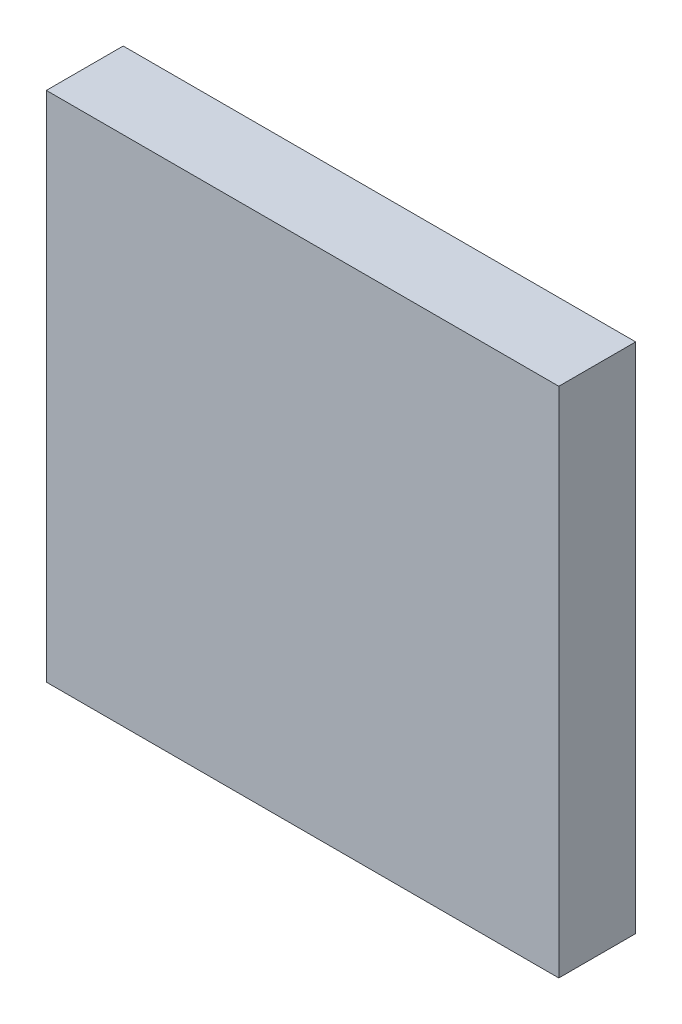
ISO-10303-21;
HEADER;
FILE_DESCRIPTION(('STEP AP214'),'2;1');
FILE_NAME('part.step','',(''),(''),'','','');
FILE_SCHEMA(('AUTOMOTIVE_DESIGN { 1 0 10303 214 1 1 1 1 }'));
ENDSEC;
DATA;
#1=APPLICATION_CONTEXT('core data for automotive mechanical design processes');
#2=APPLICATION_PROTOCOL_DEFINITION('international standard','automotive_design',2000,#1);
#3=PRODUCT_CONTEXT('',#1,'mechanical');
#4=PRODUCT('Part','Part','',(#3));
#5=PRODUCT_RELATED_PRODUCT_CATEGORY('part','',(#4));
#6=PRODUCT_DEFINITION_FORMATION('','',#4);
#7=PRODUCT_DEFINITION_CONTEXT('part definition',#1,'design');
#8=PRODUCT_DEFINITION('design','',#6,#7);
#9=PRODUCT_DEFINITION_SHAPE('','',#8);
#10=(LENGTH_UNIT() NAMED_UNIT(*) SI_UNIT(.MILLI.,.METRE.));
#11=(NAMED_UNIT(*) PLANE_ANGLE_UNIT() SI_UNIT($,.RADIAN.));
#12=(NAMED_UNIT(*) SI_UNIT($,.STERADIAN.) SOLID_ANGLE_UNIT());
#13=UNCERTAINTY_MEASURE_WITH_UNIT(LENGTH_MEASURE(1.E-05),#10,'distance_accuracy_value','');
#14=(GEOMETRIC_REPRESENTATION_CONTEXT(3) GLOBAL_UNCERTAINTY_ASSIGNED_CONTEXT((#13)) GLOBAL_UNIT_ASSIGNED_CONTEXT((#10,
#11,#12)) REPRESENTATION_CONTEXT('',''));
#15=CARTESIAN_POINT('',(0.,0.,0.));
#16=DIRECTION('',(0.,0.,1.));
#17=DIRECTION('',(1.,0.,0.));
#18=AXIS2_PLACEMENT_3D('',#15,#16,#17);
#19=CARTESIAN_POINT('',(3.499993,-3.5000184,1.0500106));
#20=DIRECTION('',(0.,1.,0.));
#21=DIRECTION('',(0.,0.,1.));
#22=AXIS2_PLACEMENT_3D('',#19,#20,#21);
#23=PLANE('',#22);
#24=DIRECTION('',(1.,0.,0.));
#25=VECTOR('',#24,1.);
#26=CARTESIAN_POINT('',(3.499993,-3.5000184,0.));
#27=LINE('',#26,#25);
#28=CARTESIAN_POINT('',(-3.499993,-3.5000184,0.));
#29=VERTEX_POINT('',#28);
#30=CARTESIAN_POINT('',(3.499993,-3.5000184,0.));
#31=VERTEX_POINT('',#30);
#32=EDGE_CURVE('E95',#29,#31,#27,.T.);
#33=ORIENTED_EDGE('',*,*,#32,.T.);
#34=DIRECTION('',(0.,0.,-1.));
#35=VECTOR('',#34,1.);
#36=CARTESIAN_POINT('',(3.499993,-3.5000184,1.0500106));
#37=LINE('',#36,#35);
#38=CARTESIAN_POINT('',(3.499993,-3.5000184,1.0500106));
#39=VERTEX_POINT('',#38);
#40=EDGE_CURVE('E11',#39,#31,#37,.T.);
#41=ORIENTED_EDGE('',*,*,#40,.F.);
#42=DIRECTION('',(1.,0.,0.));
#43=VECTOR('',#42,1.);
#44=CARTESIAN_POINT('',(3.499993,-3.5000184,1.0500106));
#45=LINE('',#44,#43);
#46=CARTESIAN_POINT('',(-3.499993,-3.5000184,1.0500106));
#47=VERTEX_POINT('',#46);
#48=EDGE_CURVE('E83',#47,#39,#45,.T.);
#49=ORIENTED_EDGE('',*,*,#48,.F.);
#50=DIRECTION('',(0.,0.,-1.));
#51=VECTOR('',#50,1.);
#52=CARTESIAN_POINT('',(-3.499993,-3.5000184,1.0500106));
#53=LINE('',#52,#51);
#54=EDGE_CURVE('E91',#47,#29,#53,.T.);
#55=ORIENTED_EDGE('',*,*,#54,.T.);
#56=EDGE_LOOP('',(#33,#41,#49,#55));
#57=FACE_BOUND('',#56,.T.);
#58=ADVANCED_FACE('F32',(#57),#23,.F.);
#59=CARTESIAN_POINT('',(3.499993,3.499993,1.0500106));
#60=DIRECTION('',(-1.,0.,0.));
#61=DIRECTION('',(0.,0.,1.));
#62=AXIS2_PLACEMENT_3D('',#59,#60,#61);
#63=PLANE('',#62);
#64=DIRECTION('',(0.,1.,0.));
#65=VECTOR('',#64,1.);
#66=CARTESIAN_POINT('',(3.499993,3.499993,0.));
#67=LINE('',#66,#65);
#68=CARTESIAN_POINT('',(3.499993,3.499993,0.));
#69=VERTEX_POINT('',#68);
#70=EDGE_CURVE('E87',#31,#69,#67,.T.);
#71=ORIENTED_EDGE('',*,*,#70,.T.);
#72=DIRECTION('',(0.,0.,-1.));
#73=VECTOR('',#72,1.);
#74=CARTESIAN_POINT('',(3.499993,3.499993,1.0500106));
#75=LINE('',#74,#73);
#76=CARTESIAN_POINT('',(3.499993,3.499993,1.0500106));
#77=VERTEX_POINT('',#76);
#78=EDGE_CURVE('E40',#77,#69,#75,.T.);
#79=ORIENTED_EDGE('',*,*,#78,.F.);
#80=DIRECTION('',(0.,1.,0.));
#81=VECTOR('',#80,1.);
#82=CARTESIAN_POINT('',(3.499993,3.499993,1.0500106));
#83=LINE('',#82,#81);
#84=EDGE_CURVE('E78',#39,#77,#83,.T.);
#85=ORIENTED_EDGE('',*,*,#84,.F.);
#86=ORIENTED_EDGE('',*,*,#40,.T.);
#87=EDGE_LOOP('',(#71,#79,#85,#86));
#88=FACE_BOUND('',#87,.T.);
#89=ADVANCED_FACE('F86',(#88),#63,.F.);
#90=CARTESIAN_POINT('',(-3.499993,3.499993,1.0500106));
#91=DIRECTION('',(0.,-1.,0.));
#92=DIRECTION('',(0.,0.,-1.));
#93=AXIS2_PLACEMENT_3D('',#90,#91,#92);
#94=PLANE('',#93);
#95=DIRECTION('',(-1.,0.,0.));
#96=VECTOR('',#95,1.);
#97=CARTESIAN_POINT('',(-3.499993,3.499993,0.));
#98=LINE('',#97,#96);
#99=CARTESIAN_POINT('',(-3.499993,3.499993,0.));
#100=VERTEX_POINT('',#99);
#101=EDGE_CURVE('E65',#69,#100,#98,.T.);
#102=ORIENTED_EDGE('',*,*,#101,.T.);
#103=DIRECTION('',(0.,0.,-1.));
#104=VECTOR('',#103,1.);
#105=CARTESIAN_POINT('',(-3.499993,3.499993,1.0500106));
#106=LINE('',#105,#104);
#107=CARTESIAN_POINT('',(-3.499993,3.499993,1.0500106));
#108=VERTEX_POINT('',#107);
#109=EDGE_CURVE('E88',#108,#100,#106,.T.);
#110=ORIENTED_EDGE('',*,*,#109,.F.);
#111=DIRECTION('',(-1.,0.,0.));
#112=VECTOR('',#111,1.);
#113=CARTESIAN_POINT('',(-3.499993,3.499993,1.0500106));
#114=LINE('',#113,#112);
#115=EDGE_CURVE('E81',#77,#108,#114,.T.);
#116=ORIENTED_EDGE('',*,*,#115,.F.);
#117=ORIENTED_EDGE('',*,*,#78,.T.);
#118=EDGE_LOOP('',(#102,#110,#116,#117));
#119=FACE_BOUND('',#118,.T.);
#120=ADVANCED_FACE('F89',(#119),#94,.F.);
#121=CARTESIAN_POINT('',(-3.499993,-3.5000184,1.0500106));
#122=DIRECTION('',(1.,0.,0.));
#123=DIRECTION('',(0.,0.,-1.));
#124=AXIS2_PLACEMENT_3D('',#121,#122,#123);
#125=PLANE('',#124);
#126=DIRECTION('',(0.,-1.,0.));
#127=VECTOR('',#126,1.);
#128=CARTESIAN_POINT('',(-3.499993,-3.5000184,0.));
#129=LINE('',#128,#127);
#130=EDGE_CURVE('E71',#100,#29,#129,.T.);
#131=ORIENTED_EDGE('',*,*,#130,.T.);
#132=ORIENTED_EDGE('',*,*,#54,.F.);
#133=DIRECTION('',(0.,-1.,0.));
#134=VECTOR('',#133,1.);
#135=CARTESIAN_POINT('',(-3.499993,-3.5000184,1.0500106));
#136=LINE('',#135,#134);
#137=EDGE_CURVE('E48',#108,#47,#136,.T.);
#138=ORIENTED_EDGE('',*,*,#137,.F.);
#139=ORIENTED_EDGE('',*,*,#109,.T.);
#140=EDGE_LOOP('',(#131,#132,#138,#139));
#141=FACE_BOUND('',#140,.T.);
#142=ADVANCED_FACE('F102',(#141),#125,.F.);
#143=CARTESIAN_POINT('',(0.,0.,1.0500106));
#144=DIRECTION('',(0.,0.,-1.));
#145=DIRECTION('',(-1.,0.,0.));
#146=AXIS2_PLACEMENT_3D('',#143,#144,#145);
#147=PLANE('',#146);
#148=ORIENTED_EDGE('',*,*,#48,.T.);
#149=ORIENTED_EDGE('',*,*,#84,.T.);
#150=ORIENTED_EDGE('',*,*,#115,.T.);
#151=ORIENTED_EDGE('',*,*,#137,.T.);
#152=EDGE_LOOP('',(#148,#149,#150,#151));
#153=FACE_BOUND('',#152,.T.);
#154=ADVANCED_FACE('F79',(#153),#147,.F.);
#155=CARTESIAN_POINT('',(0.,0.,0.));
#156=DIRECTION('',(0.,0.,-1.));
#157=DIRECTION('',(-1.,0.,0.));
#158=AXIS2_PLACEMENT_3D('',#155,#156,#157);
#159=PLANE('',#158);
#160=ORIENTED_EDGE('',*,*,#32,.F.);
#161=ORIENTED_EDGE('',*,*,#130,.F.);
#162=ORIENTED_EDGE('',*,*,#101,.F.);
#163=ORIENTED_EDGE('',*,*,#70,.F.);
#164=EDGE_LOOP('',(#160,#161,#162,#163));
#165=FACE_BOUND('',#164,.T.);
#166=ADVANCED_FACE('F105',(#165),#159,.T.);
#167=CLOSED_SHELL('',(#58,#89,#120,#142,#154,#166));
#168=MANIFOLD_SOLID_BREP('B2',#167);
#169=ADVANCED_BREP_SHAPE_REPRESENTATION('',(#18,#168),#14);
#170=SHAPE_DEFINITION_REPRESENTATION(#9,#169);
ENDSEC;
END-ISO-10303-21;
